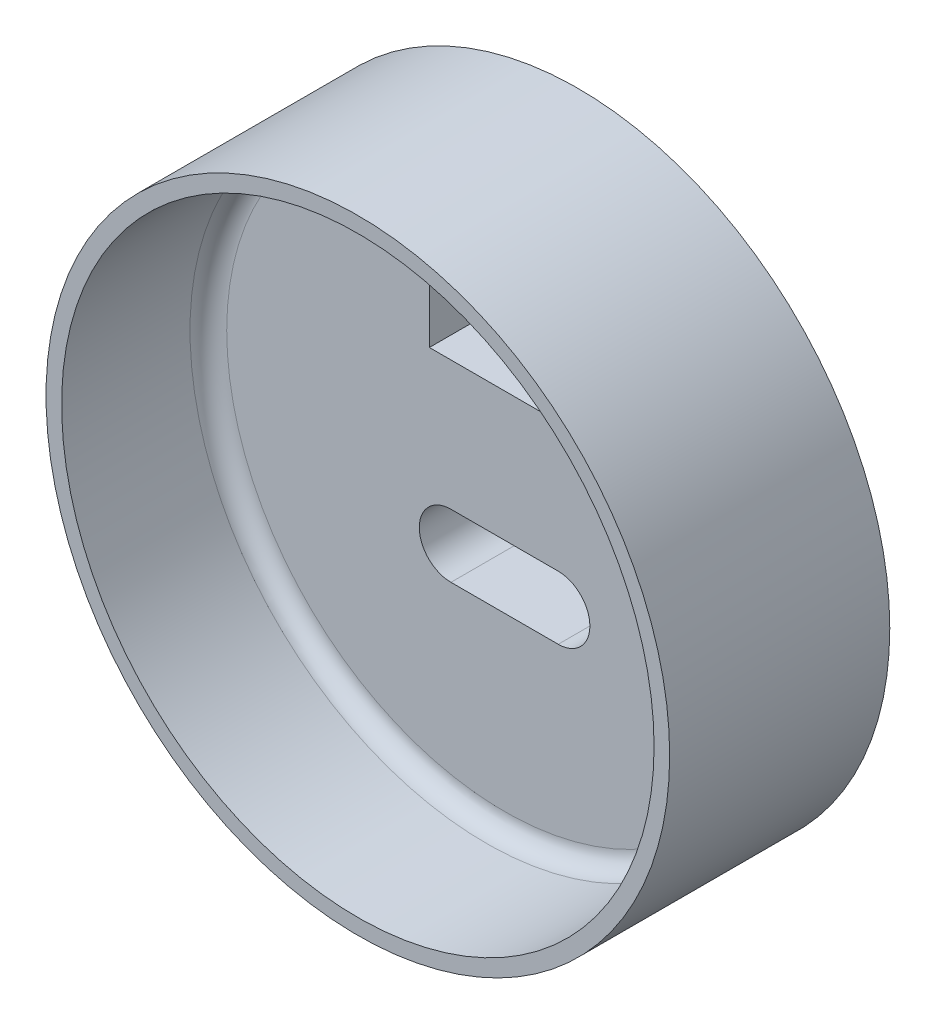
ISO-10303-21;
HEADER;
FILE_DESCRIPTION(('STEP AP214'),'2;1');
FILE_NAME('part.step','',(''),(''),'','','');
FILE_SCHEMA(('AUTOMOTIVE_DESIGN { 1 0 10303 214 1 1 1 1 }'));
ENDSEC;
DATA;
#1=APPLICATION_CONTEXT('core data for automotive mechanical design processes');
#2=APPLICATION_PROTOCOL_DEFINITION('international standard','automotive_design',2000,#1);
#3=PRODUCT_CONTEXT('',#1,'mechanical');
#4=PRODUCT('Part','Part','',(#3));
#5=PRODUCT_RELATED_PRODUCT_CATEGORY('part','',(#4));
#6=PRODUCT_DEFINITION_FORMATION('','',#4);
#7=PRODUCT_DEFINITION_CONTEXT('part definition',#1,'design');
#8=PRODUCT_DEFINITION('design','',#6,#7);
#9=PRODUCT_DEFINITION_SHAPE('','',#8);
#10=(LENGTH_UNIT() NAMED_UNIT(*) SI_UNIT(.MILLI.,.METRE.));
#11=(NAMED_UNIT(*) PLANE_ANGLE_UNIT() SI_UNIT($,.RADIAN.));
#12=(NAMED_UNIT(*) SI_UNIT($,.STERADIAN.) SOLID_ANGLE_UNIT());
#13=UNCERTAINTY_MEASURE_WITH_UNIT(LENGTH_MEASURE(1.E-05),#10,'distance_accuracy_value','');
#14=(GEOMETRIC_REPRESENTATION_CONTEXT(3) GLOBAL_UNCERTAINTY_ASSIGNED_CONTEXT((#13)) GLOBAL_UNIT_ASSIGNED_CONTEXT((#10,
#11,#12)) REPRESENTATION_CONTEXT('',''));
#15=CARTESIAN_POINT('',(0.,0.,0.));
#16=DIRECTION('',(0.,0.,1.));
#17=DIRECTION('',(1.,0.,0.));
#18=AXIS2_PLACEMENT_3D('',#15,#16,#17);
#19=CARTESIAN_POINT('',(0.,0.,12.));
#20=DIRECTION('',(0.,0.,-1.));
#21=DIRECTION('',(-1.,0.,0.));
#22=AXIS2_PLACEMENT_3D('',#19,#20,#21);
#23=CYLINDRICAL_SURFACE('',#22,17.);
#24=CARTESIAN_POINT('',(0.,0.,12.));
#25=DIRECTION('',(0.,0.,1.));
#26=DIRECTION('',(1.,0.,0.));
#27=AXIS2_PLACEMENT_3D('',#24,#25,#26);
#28=CIRCLE('',#27,17.);
#29=CARTESIAN_POINT('',(17.,0.,12.));
#30=VERTEX_POINT('',#29);
#31=EDGE_CURVE('E182',#30,#30,#28,.T.);
#32=ORIENTED_EDGE('',*,*,#31,.F.);
#33=EDGE_LOOP('',(#32));
#34=FACE_BOUND('',#33,.T.);
#35=CARTESIAN_POINT('',(0.,0.,0.));
#36=DIRECTION('',(0.,0.,1.));
#37=DIRECTION('',(1.,0.,0.));
#38=AXIS2_PLACEMENT_3D('',#35,#36,#37);
#39=CIRCLE('',#38,17.);
#40=CARTESIAN_POINT('',(17.,0.,0.));
#41=VERTEX_POINT('',#40);
#42=EDGE_CURVE('E177',#41,#41,#39,.T.);
#43=ORIENTED_EDGE('',*,*,#42,.T.);
#44=EDGE_LOOP('',(#43));
#45=FACE_BOUND('',#44,.T.);
#46=ADVANCED_FACE('F44',(#34,#45),#23,.T.);
#47=CARTESIAN_POINT('',(0.,0.,12.));
#48=DIRECTION('',(0.,0.,1.));
#49=DIRECTION('',(1.,0.,0.));
#50=AXIS2_PLACEMENT_3D('',#47,#48,#49);
#51=PLANE('',#50);
#52=CARTESIAN_POINT('',(0.,0.,12.));
#53=DIRECTION('',(0.,0.,1.));
#54=DIRECTION('',(1.,0.,0.));
#55=AXIS2_PLACEMENT_3D('',#52,#53,#54);
#56=CIRCLE('',#55,16.15);
#57=CARTESIAN_POINT('',(16.15,0.,12.));
#58=VERTEX_POINT('',#57);
#59=EDGE_CURVE('E148',#58,#58,#56,.T.);
#60=ORIENTED_EDGE('',*,*,#59,.F.);
#61=EDGE_LOOP('',(#60));
#62=FACE_BOUND('',#61,.T.);
#63=ORIENTED_EDGE('',*,*,#31,.T.);
#64=EDGE_LOOP('',(#63));
#65=FACE_BOUND('',#64,.T.);
#66=ADVANCED_FACE('F236',(#62,#65),#51,.T.);
#67=CARTESIAN_POINT('',(0.,0.,0.));
#68=DIRECTION('',(0.,0.,1.));
#69=DIRECTION('',(1.,0.,0.));
#70=AXIS2_PLACEMENT_3D('',#67,#68,#69);
#71=PLANE('',#70);
#72=DIRECTION('',(-1.,0.,0.));
#73=VECTOR('',#72,1.);
#74=CARTESIAN_POINT('',(-4.1,4.71268690738989,0.));
#75=LINE('',#74,#73);
#76=CARTESIAN_POINT('',(4.1,4.71268690738989,0.));
#77=VERTEX_POINT('',#76);
#78=CARTESIAN_POINT('',(-4.1,4.71268690738989,0.));
#79=VERTEX_POINT('',#78);
#80=EDGE_CURVE('E126',#77,#79,#75,.T.);
#81=ORIENTED_EDGE('',*,*,#80,.F.);
#82=DIRECTION('',(0.,-1.,0.));
#83=VECTOR('',#82,1.);
#84=CARTESIAN_POINT('',(4.1,4.71268690738989,0.));
#85=LINE('',#84,#83);
#86=CARTESIAN_POINT('',(4.1,7.91268690738989,0.));
#87=VERTEX_POINT('',#86);
#88=EDGE_CURVE('E63',#87,#77,#85,.T.);
#89=ORIENTED_EDGE('',*,*,#88,.F.);
#90=DIRECTION('',(1.,0.,0.));
#91=VECTOR('',#90,1.);
#92=CARTESIAN_POINT('',(-4.1,7.91268690738989,0.));
#93=LINE('',#92,#91);
#94=CARTESIAN_POINT('',(-4.1,7.91268690738989,0.));
#95=VERTEX_POINT('',#94);
#96=EDGE_CURVE('E139',#95,#87,#93,.T.);
#97=ORIENTED_EDGE('',*,*,#96,.F.);
#98=DIRECTION('',(0.,1.,0.));
#99=VECTOR('',#98,1.);
#100=CARTESIAN_POINT('',(-4.1,4.71268690738989,0.));
#101=LINE('',#100,#99);
#102=EDGE_CURVE('E120',#79,#95,#101,.T.);
#103=ORIENTED_EDGE('',*,*,#102,.F.);
#104=EDGE_LOOP('',(#81,#89,#97,#103));
#105=FACE_BOUND('',#104,.T.);
#106=DIRECTION('',(1.,0.,0.));
#107=VECTOR('',#106,1.);
#108=CARTESIAN_POINT('',(-2.92499999999999,-2.33681438291047,0.));
#109=LINE('',#108,#107);
#110=CARTESIAN_POINT('',(-2.92499999999999,-2.33681438291047,0.));
#111=VERTEX_POINT('',#110);
#112=CARTESIAN_POINT('',(2.92499999999999,-2.33681438291047,0.));
#113=VERTEX_POINT('',#112);
#114=EDGE_CURVE('E173',#111,#113,#109,.T.);
#115=ORIENTED_EDGE('',*,*,#114,.F.);
#116=CARTESIAN_POINT('',(-2.92500000000001,-4.06181438291047,0.));
#117=DIRECTION('',(0.,0.,-1.));
#118=DIRECTION('',(-1.,0.,0.));
#119=AXIS2_PLACEMENT_3D('',#116,#117,#118);
#120=CIRCLE('',#119,1.725);
#121=CARTESIAN_POINT('',(-2.92499999999999,-5.78681438291047,0.));
#122=VERTEX_POINT('',#121);
#123=EDGE_CURVE('E68',#122,#111,#120,.T.);
#124=ORIENTED_EDGE('',*,*,#123,.F.);
#125=DIRECTION('',(-1.,0.,0.));
#126=VECTOR('',#125,1.);
#127=CARTESIAN_POINT('',(-2.92499999999999,-5.78681438291047,0.));
#128=LINE('',#127,#126);
#129=CARTESIAN_POINT('',(2.92499999999999,-5.78681438291047,0.));
#130=VERTEX_POINT('',#129);
#131=EDGE_CURVE('E152',#130,#122,#128,.T.);
#132=ORIENTED_EDGE('',*,*,#131,.F.);
#133=CARTESIAN_POINT('',(2.92499999999999,-4.06181438291047,0.));
#134=DIRECTION('',(0.,0.,-1.));
#135=DIRECTION('',(-1.,0.,0.));
#136=AXIS2_PLACEMENT_3D('',#133,#134,#135);
#137=CIRCLE('',#136,1.725);
#138=EDGE_CURVE('E170',#113,#130,#137,.T.);
#139=ORIENTED_EDGE('',*,*,#138,.F.);
#140=EDGE_LOOP('',(#115,#124,#132,#139));
#141=FACE_BOUND('',#140,.T.);
#142=ORIENTED_EDGE('',*,*,#42,.F.);
#143=EDGE_LOOP('',(#142));
#144=FACE_BOUND('',#143,.T.);
#145=ADVANCED_FACE('F131',(#105,#141,#144),#71,.F.);
#146=CARTESIAN_POINT('',(0.,0.,4.));
#147=DIRECTION('',(0.,0.,1.));
#148=DIRECTION('',(1.,0.,0.));
#149=AXIS2_PLACEMENT_3D('',#146,#147,#148);
#150=CYLINDRICAL_SURFACE('',#149,16.15);
#151=CARTESIAN_POINT('',(0.,0.,5.));
#152=DIRECTION('',(0.,0.,1.));
#153=DIRECTION('',(1.,0.,0.));
#154=AXIS2_PLACEMENT_3D('',#151,#152,#153);
#155=CIRCLE('',#154,16.15);
#156=CARTESIAN_POINT('',(16.15,0.,5.));
#157=VERTEX_POINT('',#156);
#158=EDGE_CURVE('E191',#157,#157,#155,.F.);
#159=ORIENTED_EDGE('',*,*,#158,.T.);
#160=EDGE_LOOP('',(#159));
#161=FACE_BOUND('',#160,.T.);
#162=ORIENTED_EDGE('',*,*,#59,.T.);
#163=EDGE_LOOP('',(#162));
#164=FACE_BOUND('',#163,.T.);
#165=ADVANCED_FACE('F248',(#161,#164),#150,.F.);
#166=CARTESIAN_POINT('',(0.,0.,4.));
#167=DIRECTION('',(0.,0.,1.));
#168=DIRECTION('',(1.,0.,0.));
#169=AXIS2_PLACEMENT_3D('',#166,#167,#168);
#170=PLANE('',#169);
#171=DIRECTION('',(0.,1.,0.));
#172=VECTOR('',#171,1.);
#173=CARTESIAN_POINT('',(4.1,0.,4.));
#174=LINE('',#173,#172);
#175=CARTESIAN_POINT('',(4.1,4.71268690738989,4.));
#176=VERTEX_POINT('',#175);
#177=CARTESIAN_POINT('',(4.1,7.91268690738989,4.));
#178=VERTEX_POINT('',#177);
#179=EDGE_CURVE('E11',#176,#178,#174,.T.);
#180=ORIENTED_EDGE('',*,*,#179,.F.);
#181=DIRECTION('',(1.,0.,0.));
#182=VECTOR('',#181,1.);
#183=CARTESIAN_POINT('',(0.,4.71268690738989,4.));
#184=LINE('',#183,#182);
#185=CARTESIAN_POINT('',(-4.1,4.71268690738989,4.));
#186=VERTEX_POINT('',#185);
#187=EDGE_CURVE('E207',#186,#176,#184,.T.);
#188=ORIENTED_EDGE('',*,*,#187,.F.);
#189=DIRECTION('',(0.,-1.,0.));
#190=VECTOR('',#189,1.);
#191=CARTESIAN_POINT('',(-4.1,0.,4.));
#192=LINE('',#191,#190);
#193=CARTESIAN_POINT('',(-4.1,7.91268690738989,4.));
#194=VERTEX_POINT('',#193);
#195=EDGE_CURVE('E117',#194,#186,#192,.T.);
#196=ORIENTED_EDGE('',*,*,#195,.F.);
#197=DIRECTION('',(-1.,0.,0.));
#198=VECTOR('',#197,1.);
#199=CARTESIAN_POINT('',(0.,7.91268690738989,4.));
#200=LINE('',#199,#198);
#201=EDGE_CURVE('E53',#178,#194,#200,.T.);
#202=ORIENTED_EDGE('',*,*,#201,.F.);
#203=EDGE_LOOP('',(#180,#188,#196,#202));
#204=FACE_BOUND('',#203,.T.);
#205=CARTESIAN_POINT('',(-2.92500000000001,-4.06181438291047,4.));
#206=DIRECTION('',(0.,0.,1.));
#207=DIRECTION('',(1.,0.,0.));
#208=AXIS2_PLACEMENT_3D('',#205,#206,#207);
#209=CIRCLE('',#208,1.725);
#210=CARTESIAN_POINT('',(-2.92499999999999,-2.33681438291047,4.));
#211=VERTEX_POINT('',#210);
#212=CARTESIAN_POINT('',(-2.92499999999999,-5.78681438291047,4.));
#213=VERTEX_POINT('',#212);
#214=EDGE_CURVE('E206',#211,#213,#209,.T.);
#215=ORIENTED_EDGE('',*,*,#214,.F.);
#216=DIRECTION('',(-1.,0.,0.));
#217=VECTOR('',#216,1.);
#218=CARTESIAN_POINT('',(0.,-2.33681438291047,4.));
#219=LINE('',#218,#217);
#220=CARTESIAN_POINT('',(2.92499999999999,-2.33681438291047,4.));
#221=VERTEX_POINT('',#220);
#222=EDGE_CURVE('E198',#221,#211,#219,.T.);
#223=ORIENTED_EDGE('',*,*,#222,.F.);
#224=CARTESIAN_POINT('',(2.92499999999999,-4.06181438291047,4.));
#225=DIRECTION('',(0.,0.,1.));
#226=DIRECTION('',(1.,0.,0.));
#227=AXIS2_PLACEMENT_3D('',#224,#225,#226);
#228=CIRCLE('',#227,1.725);
#229=CARTESIAN_POINT('',(2.92499999999999,-5.78681438291047,4.));
#230=VERTEX_POINT('',#229);
#231=EDGE_CURVE('E200',#230,#221,#228,.T.);
#232=ORIENTED_EDGE('',*,*,#231,.F.);
#233=DIRECTION('',(1.,0.,0.));
#234=VECTOR('',#233,1.);
#235=CARTESIAN_POINT('',(0.,-5.78681438291047,4.));
#236=LINE('',#235,#234);
#237=EDGE_CURVE('E201',#213,#230,#236,.T.);
#238=ORIENTED_EDGE('',*,*,#237,.F.);
#239=EDGE_LOOP('',(#215,#223,#232,#238));
#240=FACE_BOUND('',#239,.T.);
#241=CARTESIAN_POINT('',(0.,0.,4.));
#242=DIRECTION('',(0.,0.,1.));
#243=DIRECTION('',(1.,0.,0.));
#244=AXIS2_PLACEMENT_3D('',#241,#242,#243);
#245=CIRCLE('',#244,15.15);
#246=CARTESIAN_POINT('',(15.15,0.,4.));
#247=VERTEX_POINT('',#246);
#248=EDGE_CURVE('E183',#247,#247,#245,.T.);
#249=ORIENTED_EDGE('',*,*,#248,.T.);
#250=EDGE_LOOP('',(#249));
#251=FACE_BOUND('',#250,.T.);
#252=ADVANCED_FACE('F219',(#204,#240,#251),#170,.T.);
#253=CARTESIAN_POINT('',(0.,0.,5.));
#254=DIRECTION('',(0.,0.,1.));
#255=DIRECTION('',(1.,0.,0.));
#256=AXIS2_PLACEMENT_3D('',#253,#254,#255);
#257=TOROIDAL_SURFACE('',#256,15.15,1.);
#258=ORIENTED_EDGE('',*,*,#158,.F.);
#259=EDGE_LOOP('',(#258));
#260=FACE_BOUND('',#259,.T.);
#261=ORIENTED_EDGE('',*,*,#248,.F.);
#262=EDGE_LOOP('',(#261));
#263=FACE_BOUND('',#262,.T.);
#264=ADVANCED_FACE('F50',(#260,#263),#257,.F.);
#265=CARTESIAN_POINT('',(-2.92500000000001,-4.06181438291047,12.));
#266=DIRECTION('',(0.,0.,-1.));
#267=DIRECTION('',(-1.,0.,0.));
#268=AXIS2_PLACEMENT_3D('',#265,#266,#267);
#269=CYLINDRICAL_SURFACE('',#268,1.725);
#270=ORIENTED_EDGE('',*,*,#214,.T.);
#271=DIRECTION('',(0.,0.,-1.));
#272=VECTOR('',#271,1.);
#273=CARTESIAN_POINT('',(-2.92499999999999,-5.78681438291047,12.));
#274=LINE('',#273,#272);
#275=EDGE_CURVE('E161',#213,#122,#274,.T.);
#276=ORIENTED_EDGE('',*,*,#275,.T.);
#277=ORIENTED_EDGE('',*,*,#123,.T.);
#278=DIRECTION('',(0.,0.,-1.));
#279=VECTOR('',#278,1.);
#280=CARTESIAN_POINT('',(-2.92499999999999,-2.33681438291047,12.));
#281=LINE('',#280,#279);
#282=EDGE_CURVE('E151',#211,#111,#281,.T.);
#283=ORIENTED_EDGE('',*,*,#282,.F.);
#284=EDGE_LOOP('',(#270,#276,#277,#283));
#285=FACE_BOUND('',#284,.T.);
#286=ADVANCED_FACE('F259',(#285),#269,.F.);
#287=CARTESIAN_POINT('',(-2.92499999999999,-5.78681438291047,12.));
#288=DIRECTION('',(0.,-1.,0.));
#289=DIRECTION('',(0.,0.,-1.));
#290=AXIS2_PLACEMENT_3D('',#287,#288,#289);
#291=PLANE('',#290);
#292=ORIENTED_EDGE('',*,*,#237,.T.);
#293=DIRECTION('',(0.,0.,-1.));
#294=VECTOR('',#293,1.);
#295=CARTESIAN_POINT('',(2.92499999999999,-5.78681438291047,12.));
#296=LINE('',#295,#294);
#297=EDGE_CURVE('E158',#230,#130,#296,.T.);
#298=ORIENTED_EDGE('',*,*,#297,.T.);
#299=ORIENTED_EDGE('',*,*,#131,.T.);
#300=ORIENTED_EDGE('',*,*,#275,.F.);
#301=EDGE_LOOP('',(#292,#298,#299,#300));
#302=FACE_BOUND('',#301,.T.);
#303=ADVANCED_FACE('F258',(#302),#291,.F.);
#304=CARTESIAN_POINT('',(2.92499999999999,-4.06181438291047,12.));
#305=DIRECTION('',(0.,0.,-1.));
#306=DIRECTION('',(-1.,0.,0.));
#307=AXIS2_PLACEMENT_3D('',#304,#305,#306);
#308=CYLINDRICAL_SURFACE('',#307,1.725);
#309=ORIENTED_EDGE('',*,*,#231,.T.);
#310=DIRECTION('',(0.,0.,-1.));
#311=VECTOR('',#310,1.);
#312=CARTESIAN_POINT('',(2.92499999999999,-2.33681438291047,12.));
#313=LINE('',#312,#311);
#314=EDGE_CURVE('E154',#221,#113,#313,.T.);
#315=ORIENTED_EDGE('',*,*,#314,.T.);
#316=ORIENTED_EDGE('',*,*,#138,.T.);
#317=ORIENTED_EDGE('',*,*,#297,.F.);
#318=EDGE_LOOP('',(#309,#315,#316,#317));
#319=FACE_BOUND('',#318,.T.);
#320=ADVANCED_FACE('F231',(#319),#308,.F.);
#321=CARTESIAN_POINT('',(-2.92499999999999,-2.33681438291047,12.));
#322=DIRECTION('',(0.,1.,0.));
#323=DIRECTION('',(0.,0.,1.));
#324=AXIS2_PLACEMENT_3D('',#321,#322,#323);
#325=PLANE('',#324);
#326=ORIENTED_EDGE('',*,*,#222,.T.);
#327=ORIENTED_EDGE('',*,*,#282,.T.);
#328=ORIENTED_EDGE('',*,*,#114,.T.);
#329=ORIENTED_EDGE('',*,*,#314,.F.);
#330=EDGE_LOOP('',(#326,#327,#328,#329));
#331=FACE_BOUND('',#330,.T.);
#332=ADVANCED_FACE('F223',(#331),#325,.F.);
#333=CARTESIAN_POINT('',(4.1,4.71268690738989,12.));
#334=DIRECTION('',(1.,0.,0.));
#335=DIRECTION('',(0.,0.,-1.));
#336=AXIS2_PLACEMENT_3D('',#333,#334,#335);
#337=PLANE('',#336);
#338=ORIENTED_EDGE('',*,*,#179,.T.);
#339=DIRECTION('',(0.,0.,-1.));
#340=VECTOR('',#339,1.);
#341=CARTESIAN_POINT('',(4.1,7.91268690738989,12.));
#342=LINE('',#341,#340);
#343=EDGE_CURVE('E141',#178,#87,#342,.T.);
#344=ORIENTED_EDGE('',*,*,#343,.T.);
#345=ORIENTED_EDGE('',*,*,#88,.T.);
#346=DIRECTION('',(0.,0.,-1.));
#347=VECTOR('',#346,1.);
#348=CARTESIAN_POINT('',(4.1,4.71268690738989,12.));
#349=LINE('',#348,#347);
#350=EDGE_CURVE('E122',#176,#77,#349,.T.);
#351=ORIENTED_EDGE('',*,*,#350,.F.);
#352=EDGE_LOOP('',(#338,#344,#345,#351));
#353=FACE_BOUND('',#352,.T.);
#354=ADVANCED_FACE('F225',(#353),#337,.F.);
#355=CARTESIAN_POINT('',(-4.1,7.91268690738989,12.));
#356=DIRECTION('',(0.,1.,0.));
#357=DIRECTION('',(0.,0.,1.));
#358=AXIS2_PLACEMENT_3D('',#355,#356,#357);
#359=PLANE('',#358);
#360=ORIENTED_EDGE('',*,*,#201,.T.);
#361=DIRECTION('',(0.,0.,-1.));
#362=VECTOR('',#361,1.);
#363=CARTESIAN_POINT('',(-4.1,7.91268690738989,12.));
#364=LINE('',#363,#362);
#365=EDGE_CURVE('E123',#194,#95,#364,.T.);
#366=ORIENTED_EDGE('',*,*,#365,.T.);
#367=ORIENTED_EDGE('',*,*,#96,.T.);
#368=ORIENTED_EDGE('',*,*,#343,.F.);
#369=EDGE_LOOP('',(#360,#366,#367,#368));
#370=FACE_BOUND('',#369,.T.);
#371=ADVANCED_FACE('F220',(#370),#359,.F.);
#372=CARTESIAN_POINT('',(-4.1,4.71268690738989,12.));
#373=DIRECTION('',(-1.,0.,0.));
#374=DIRECTION('',(0.,0.,1.));
#375=AXIS2_PLACEMENT_3D('',#372,#373,#374);
#376=PLANE('',#375);
#377=ORIENTED_EDGE('',*,*,#195,.T.);
#378=DIRECTION('',(0.,0.,-1.));
#379=VECTOR('',#378,1.);
#380=CARTESIAN_POINT('',(-4.1,4.71268690738989,12.));
#381=LINE('',#380,#379);
#382=EDGE_CURVE('E115',#186,#79,#381,.T.);
#383=ORIENTED_EDGE('',*,*,#382,.T.);
#384=ORIENTED_EDGE('',*,*,#102,.T.);
#385=ORIENTED_EDGE('',*,*,#365,.F.);
#386=EDGE_LOOP('',(#377,#383,#384,#385));
#387=FACE_BOUND('',#386,.T.);
#388=ADVANCED_FACE('F111',(#387),#376,.F.);
#389=CARTESIAN_POINT('',(-4.1,4.71268690738989,12.));
#390=DIRECTION('',(0.,-1.,0.));
#391=DIRECTION('',(1.,0.,0.));
#392=AXIS2_PLACEMENT_3D('',#389,#390,#391);
#393=PLANE('',#392);
#394=ORIENTED_EDGE('',*,*,#187,.T.);
#395=ORIENTED_EDGE('',*,*,#350,.T.);
#396=ORIENTED_EDGE('',*,*,#80,.T.);
#397=ORIENTED_EDGE('',*,*,#382,.F.);
#398=EDGE_LOOP('',(#394,#395,#396,#397));
#399=FACE_BOUND('',#398,.T.);
#400=ADVANCED_FACE('F129',(#399),#393,.F.);
#401=CLOSED_SHELL('',(#46,#66,#145,#165,#252,#264,#286,#303,#320,#332,#354,#371,#388,#400));
#402=MANIFOLD_SOLID_BREP('B2',#401);
#403=ADVANCED_BREP_SHAPE_REPRESENTATION('',(#18,#402),#14);
#404=SHAPE_DEFINITION_REPRESENTATION(#9,#403);
ENDSEC;
END-ISO-10303-21;
